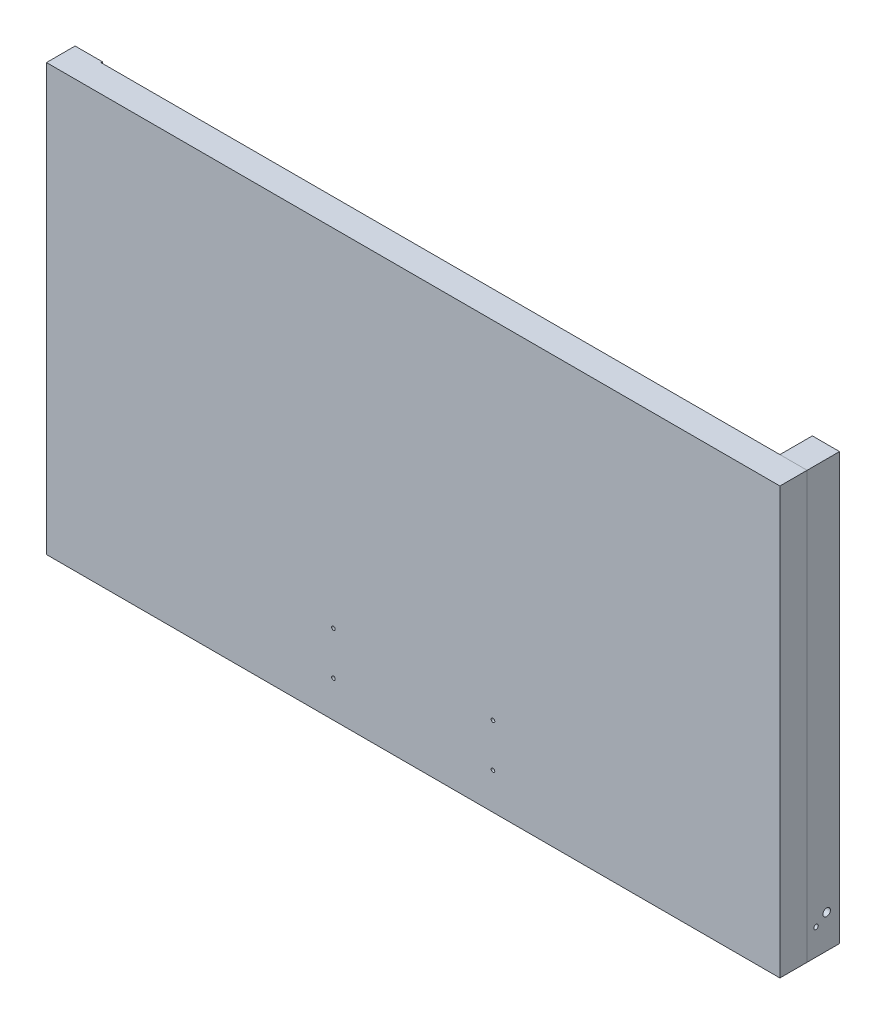
ISO-10303-21;
HEADER;
FILE_DESCRIPTION(('STEP AP214'),'2;1');
FILE_NAME('part.step','',(''),(''),'','','');
FILE_SCHEMA(('AUTOMOTIVE_DESIGN { 1 0 10303 214 1 1 1 1 }'));
ENDSEC;
DATA;
#1=APPLICATION_CONTEXT('core data for automotive mechanical design processes');
#2=APPLICATION_PROTOCOL_DEFINITION('international standard','automotive_design',2000,#1);
#3=PRODUCT_CONTEXT('',#1,'mechanical');
#4=PRODUCT('Part','Part','',(#3));
#5=PRODUCT_RELATED_PRODUCT_CATEGORY('part','',(#4));
#6=PRODUCT_DEFINITION_FORMATION('','',#4);
#7=PRODUCT_DEFINITION_CONTEXT('part definition',#1,'design');
#8=PRODUCT_DEFINITION('design','',#6,#7);
#9=PRODUCT_DEFINITION_SHAPE('','',#8);
#10=(LENGTH_UNIT() NAMED_UNIT(*) SI_UNIT(.MILLI.,.METRE.));
#11=(NAMED_UNIT(*) PLANE_ANGLE_UNIT() SI_UNIT($,.RADIAN.));
#12=(NAMED_UNIT(*) SI_UNIT($,.STERADIAN.) SOLID_ANGLE_UNIT());
#13=UNCERTAINTY_MEASURE_WITH_UNIT(LENGTH_MEASURE(1.E-05),#10,'distance_accuracy_value','');
#14=(GEOMETRIC_REPRESENTATION_CONTEXT(3) GLOBAL_UNCERTAINTY_ASSIGNED_CONTEXT((#13)) GLOBAL_UNIT_ASSIGNED_CONTEXT((#10,
#11,#12)) REPRESENTATION_CONTEXT('',''));
#15=CARTESIAN_POINT('',(0.,0.,0.));
#16=DIRECTION('',(0.,0.,1.));
#17=DIRECTION('',(1.,0.,0.));
#18=AXIS2_PLACEMENT_3D('',#15,#16,#17);
#19=CARTESIAN_POINT('',(490.77,296.1,0.));
#20=DIRECTION('',(0.,0.,1.));
#21=DIRECTION('',(1.,0.,0.));
#22=AXIS2_PLACEMENT_3D('',#19,#20,#21);
#23=PLANE('',#22);
#24=DIRECTION('',(0.,-1.,0.));
#25=VECTOR('',#24,1.);
#26=CARTESIAN_POINT('',(509.67,296.1,0.));
#27=LINE('',#26,#25);
#28=CARTESIAN_POINT('',(509.67,296.1,0.));
#29=VERTEX_POINT('',#28);
#30=CARTESIAN_POINT('',(509.67,0.,0.));
#31=VERTEX_POINT('',#30);
#32=EDGE_CURVE('E114',#29,#31,#27,.T.);
#33=ORIENTED_EDGE('',*,*,#32,.F.);
#34=DIRECTION('',(1.,0.,0.));
#35=VECTOR('',#34,1.);
#36=CARTESIAN_POINT('',(490.77,296.1,0.));
#37=LINE('',#36,#35);
#38=CARTESIAN_POINT('',(490.77,296.1,0.));
#39=VERTEX_POINT('',#38);
#40=EDGE_CURVE('E12',#39,#29,#37,.T.);
#41=ORIENTED_EDGE('',*,*,#40,.F.);
#42=DIRECTION('',(0.,-1.,0.));
#43=VECTOR('',#42,1.);
#44=CARTESIAN_POINT('',(490.77,296.1,0.));
#45=LINE('',#44,#43);
#46=CARTESIAN_POINT('',(490.77,0.,0.));
#47=VERTEX_POINT('',#46);
#48=EDGE_CURVE('E107',#39,#47,#45,.T.);
#49=ORIENTED_EDGE('',*,*,#48,.T.);
#50=DIRECTION('',(1.,0.,0.));
#51=VECTOR('',#50,1.);
#52=CARTESIAN_POINT('',(490.77,0.,0.));
#53=LINE('',#52,#51);
#54=EDGE_CURVE('E52',#47,#31,#53,.T.);
#55=ORIENTED_EDGE('',*,*,#54,.T.);
#56=EDGE_LOOP('',(#33,#41,#49,#55));
#57=FACE_BOUND('',#56,.T.);
#58=ADVANCED_FACE('F49',(#57),#23,.T.);
#59=CARTESIAN_POINT('',(490.77,296.1,0.));
#60=DIRECTION('',(0.,1.,0.));
#61=DIRECTION('',(0.,0.,1.));
#62=AXIS2_PLACEMENT_3D('',#59,#60,#61);
#63=PLANE('',#62);
#64=DIRECTION('',(0.,0.,1.));
#65=VECTOR('',#64,1.);
#66=CARTESIAN_POINT('',(509.67,296.1,0.));
#67=LINE('',#66,#65);
#68=CARTESIAN_POINT('',(509.67,296.1,-22.5375388618416));
#69=VERTEX_POINT('',#68);
#70=EDGE_CURVE('E109',#69,#29,#67,.T.);
#71=ORIENTED_EDGE('',*,*,#70,.F.);
#72=DIRECTION('',(1.,0.,0.));
#73=VECTOR('',#72,1.);
#74=CARTESIAN_POINT('',(490.77,296.1,-22.5375388618416));
#75=LINE('',#74,#73);
#76=CARTESIAN_POINT('',(490.77,296.1,-22.5375388618416));
#77=VERTEX_POINT('',#76);
#78=EDGE_CURVE('E58',#77,#69,#75,.T.);
#79=ORIENTED_EDGE('',*,*,#78,.F.);
#80=DIRECTION('',(0.,0.,1.));
#81=VECTOR('',#80,1.);
#82=CARTESIAN_POINT('',(490.77,296.1,0.));
#83=LINE('',#82,#81);
#84=EDGE_CURVE('E104',#77,#39,#83,.T.);
#85=ORIENTED_EDGE('',*,*,#84,.T.);
#86=ORIENTED_EDGE('',*,*,#40,.T.);
#87=EDGE_LOOP('',(#71,#79,#85,#86));
#88=FACE_BOUND('',#87,.T.);
#89=ADVANCED_FACE('F125',(#88),#63,.T.);
#90=CARTESIAN_POINT('',(490.77,296.1,-22.5375388618416));
#91=DIRECTION('',(0.,0.,-1.));
#92=DIRECTION('',(0.,1.,0.));
#93=AXIS2_PLACEMENT_3D('',#90,#91,#92);
#94=PLANE('',#93);
#95=DIRECTION('',(0.,1.,0.));
#96=VECTOR('',#95,1.);
#97=CARTESIAN_POINT('',(509.67,296.1,-22.5375388618416));
#98=LINE('',#97,#96);
#99=CARTESIAN_POINT('',(509.67,0.,-22.5375388618417));
#100=VERTEX_POINT('',#99);
#101=EDGE_CURVE('E99',#100,#69,#98,.T.);
#102=ORIENTED_EDGE('',*,*,#101,.F.);
#103=DIRECTION('',(1.,0.,0.));
#104=VECTOR('',#103,1.);
#105=CARTESIAN_POINT('',(490.77,0.,-22.5375388618417));
#106=LINE('',#105,#104);
#107=CARTESIAN_POINT('',(490.77,0.,-22.5375388618417));
#108=VERTEX_POINT('',#107);
#109=EDGE_CURVE('E94',#108,#100,#106,.T.);
#110=ORIENTED_EDGE('',*,*,#109,.F.);
#111=DIRECTION('',(0.,1.,0.));
#112=VECTOR('',#111,1.);
#113=CARTESIAN_POINT('',(490.77,296.1,-22.5375388618416));
#114=LINE('',#113,#112);
#115=EDGE_CURVE('E97',#108,#77,#114,.T.);
#116=ORIENTED_EDGE('',*,*,#115,.T.);
#117=ORIENTED_EDGE('',*,*,#78,.T.);
#118=EDGE_LOOP('',(#102,#110,#116,#117));
#119=FACE_BOUND('',#118,.T.);
#120=ADVANCED_FACE('F96',(#119),#94,.T.);
#121=CARTESIAN_POINT('',(490.77,0.,0.));
#122=DIRECTION('',(0.,-1.,0.));
#123=DIRECTION('',(0.,0.,-1.));
#124=AXIS2_PLACEMENT_3D('',#121,#122,#123);
#125=PLANE('',#124);
#126=DIRECTION('',(0.,0.,-1.));
#127=VECTOR('',#126,1.);
#128=CARTESIAN_POINT('',(509.67,0.,0.));
#129=LINE('',#128,#127);
#130=EDGE_CURVE('E117',#31,#100,#129,.T.);
#131=ORIENTED_EDGE('',*,*,#130,.F.);
#132=ORIENTED_EDGE('',*,*,#54,.F.);
#133=DIRECTION('',(0.,0.,-1.));
#134=VECTOR('',#133,1.);
#135=CARTESIAN_POINT('',(490.77,0.,0.));
#136=LINE('',#135,#134);
#137=EDGE_CURVE('E103',#47,#108,#136,.T.);
#138=ORIENTED_EDGE('',*,*,#137,.T.);
#139=ORIENTED_EDGE('',*,*,#109,.T.);
#140=EDGE_LOOP('',(#131,#132,#138,#139));
#141=FACE_BOUND('',#140,.T.);
#142=ADVANCED_FACE('F106',(#141),#125,.T.);
#143=CARTESIAN_POINT('',(490.77,0.,0.));
#144=DIRECTION('',(1.,0.,0.));
#145=DIRECTION('',(0.,0.,-1.));
#146=AXIS2_PLACEMENT_3D('',#143,#144,#145);
#147=PLANE('',#146);
#148=CARTESIAN_POINT('',(490.77,23.3159423896292,-13.5682290739743));
#149=DIRECTION('',(1.,0.,0.));
#150=DIRECTION('',(0.,0.,-1.));
#151=AXIS2_PLACEMENT_3D('',#148,#149,#150);
#152=CIRCLE('',#151,2.6);
#153=CARTESIAN_POINT('',(490.77,23.3159423896292,-16.1682290739743));
#154=VERTEX_POINT('',#153);
#155=EDGE_CURVE('E158',#154,#154,#152,.T.);
#156=ORIENTED_EDGE('',*,*,#155,.T.);
#157=EDGE_LOOP('',(#156));
#158=FACE_BOUND('',#157,.T.);
#159=CARTESIAN_POINT('',(490.77,18.1537544624698,-6.19586067537359));
#160=DIRECTION('',(1.,0.,0.));
#161=DIRECTION('',(0.,0.,-1.));
#162=AXIS2_PLACEMENT_3D('',#159,#160,#161);
#163=CIRCLE('',#162,1.57499999999978);
#164=CARTESIAN_POINT('',(490.77,18.1537544624698,-7.77086067537337));
#165=VERTEX_POINT('',#164);
#166=EDGE_CURVE('E118',#165,#165,#163,.T.);
#167=ORIENTED_EDGE('',*,*,#166,.T.);
#168=EDGE_LOOP('',(#167));
#169=FACE_BOUND('',#168,.T.);
#170=ORIENTED_EDGE('',*,*,#48,.F.);
#171=ORIENTED_EDGE('',*,*,#84,.F.);
#172=ORIENTED_EDGE('',*,*,#115,.F.);
#173=ORIENTED_EDGE('',*,*,#137,.F.);
#174=EDGE_LOOP('',(#170,#171,#172,#173));
#175=FACE_BOUND('',#174,.T.);
#176=ADVANCED_FACE('F102',(#158,#169,#175),#147,.F.);
#177=CARTESIAN_POINT('',(509.67,0.,0.));
#178=DIRECTION('',(1.,0.,0.));
#179=DIRECTION('',(0.,0.,-1.));
#180=AXIS2_PLACEMENT_3D('',#177,#178,#179);
#181=PLANE('',#180);
#182=CARTESIAN_POINT('',(509.67,23.3159423896292,-13.5682290739743));
#183=DIRECTION('',(1.,0.,0.));
#184=DIRECTION('',(0.,0.,-1.));
#185=AXIS2_PLACEMENT_3D('',#182,#183,#184);
#186=CIRCLE('',#185,2.6);
#187=CARTESIAN_POINT('',(509.67,23.3159423896292,-16.1682290739743));
#188=VERTEX_POINT('',#187);
#189=EDGE_CURVE('E161',#188,#188,#186,.T.);
#190=ORIENTED_EDGE('',*,*,#189,.F.);
#191=EDGE_LOOP('',(#190));
#192=FACE_BOUND('',#191,.T.);
#193=CARTESIAN_POINT('',(509.67,18.1537544624698,-6.19586067537359));
#194=DIRECTION('',(1.,0.,0.));
#195=DIRECTION('',(0.,0.,-1.));
#196=AXIS2_PLACEMENT_3D('',#193,#194,#195);
#197=CIRCLE('',#196,1.57499999999978);
#198=CARTESIAN_POINT('',(509.67,18.1537544624698,-7.77086067537337));
#199=VERTEX_POINT('',#198);
#200=EDGE_CURVE('E163',#199,#199,#197,.T.);
#201=ORIENTED_EDGE('',*,*,#200,.F.);
#202=EDGE_LOOP('',(#201));
#203=FACE_BOUND('',#202,.T.);
#204=ORIENTED_EDGE('',*,*,#32,.T.);
#205=ORIENTED_EDGE('',*,*,#130,.T.);
#206=ORIENTED_EDGE('',*,*,#101,.T.);
#207=ORIENTED_EDGE('',*,*,#70,.T.);
#208=EDGE_LOOP('',(#204,#205,#206,#207));
#209=FACE_BOUND('',#208,.T.);
#210=ADVANCED_FACE('F124',(#192,#203,#209),#181,.T.);
#211=CARTESIAN_POINT('',(490.77,18.1537544624698,-6.19586067537359));
#212=DIRECTION('',(1.,0.,0.));
#213=DIRECTION('',(0.,0.,-1.));
#214=AXIS2_PLACEMENT_3D('',#211,#212,#213);
#215=CYLINDRICAL_SURFACE('',#214,1.57499999999978);
#216=ORIENTED_EDGE('',*,*,#166,.F.);
#217=EDGE_LOOP('',(#216));
#218=FACE_BOUND('',#217,.T.);
#219=ORIENTED_EDGE('',*,*,#200,.T.);
#220=EDGE_LOOP('',(#219));
#221=FACE_BOUND('',#220,.T.);
#222=ADVANCED_FACE('F143',(#218,#221),#215,.F.);
#223=CARTESIAN_POINT('',(490.77,23.3159423896292,-13.5682290739743));
#224=DIRECTION('',(1.,0.,0.));
#225=DIRECTION('',(0.,0.,-1.));
#226=AXIS2_PLACEMENT_3D('',#223,#224,#225);
#227=CYLINDRICAL_SURFACE('',#226,2.6);
#228=ORIENTED_EDGE('',*,*,#155,.F.);
#229=EDGE_LOOP('',(#228));
#230=FACE_BOUND('',#229,.T.);
#231=ORIENTED_EDGE('',*,*,#189,.T.);
#232=EDGE_LOOP('',(#231));
#233=FACE_BOUND('',#232,.T.);
#234=ADVANCED_FACE('F150',(#230,#233),#227,.F.);
#235=CLOSED_SHELL('',(#58,#89,#120,#142,#176,#210,#222,#234));
#236=MANIFOLD_SOLID_BREP('B2',#235);
#237=CARTESIAN_POINT('',(0.,0.,18.9));
#238=DIRECTION('',(0.,0.,-1.));
#239=DIRECTION('',(-1.,0.,0.));
#240=AXIS2_PLACEMENT_3D('',#237,#238,#239);
#241=PLANE('',#240);
#242=CARTESIAN_POINT('',(310.28,55.3497179719063,18.9));
#243=DIRECTION('',(0.,0.,1.));
#244=DIRECTION('',(1.,0.,0.));
#245=AXIS2_PLACEMENT_3D('',#242,#243,#244);
#246=CIRCLE('',#245,1.26499999999998);
#247=CARTESIAN_POINT('',(311.545,55.3497179719063,18.9));
#248=VERTEX_POINT('',#247);
#249=EDGE_CURVE('E339',#248,#248,#246,.T.);
#250=ORIENTED_EDGE('',*,*,#249,.F.);
#251=EDGE_LOOP('',(#250));
#252=FACE_BOUND('',#251,.T.);
#253=CARTESIAN_POINT('',(310.28,25.3497179719062,18.9));
#254=DIRECTION('',(0.,0.,1.));
#255=DIRECTION('',(1.,0.,0.));
#256=AXIS2_PLACEMENT_3D('',#253,#254,#255);
#257=CIRCLE('',#256,1.26499999999998);
#258=CARTESIAN_POINT('',(311.545,25.3497179719062,18.9));
#259=VERTEX_POINT('',#258);
#260=EDGE_CURVE('E325',#259,#259,#257,.T.);
#261=ORIENTED_EDGE('',*,*,#260,.F.);
#262=EDGE_LOOP('',(#261));
#263=FACE_BOUND('',#262,.T.);
#264=DIRECTION('',(0.,-1.,0.));
#265=VECTOR('',#264,1.);
#266=CARTESIAN_POINT('',(0.,0.,18.9));
#267=LINE('',#266,#265);
#268=CARTESIAN_POINT('',(0.,296.1,18.9));
#269=VERTEX_POINT('',#268);
#270=CARTESIAN_POINT('',(0.,0.,18.9));
#271=VERTEX_POINT('',#270);
#272=EDGE_CURVE('E307',#269,#271,#267,.T.);
#273=ORIENTED_EDGE('',*,*,#272,.T.);
#274=DIRECTION('',(1.,0.,0.));
#275=VECTOR('',#274,1.);
#276=CARTESIAN_POINT('',(0.,0.,18.9));
#277=LINE('',#276,#275);
#278=CARTESIAN_POINT('',(509.67,0.,18.9));
#279=VERTEX_POINT('',#278);
#280=EDGE_CURVE('E264',#271,#279,#277,.T.);
#281=ORIENTED_EDGE('',*,*,#280,.T.);
#282=DIRECTION('',(0.,1.,0.));
#283=VECTOR('',#282,1.);
#284=CARTESIAN_POINT('',(509.67,0.,18.9));
#285=LINE('',#284,#283);
#286=CARTESIAN_POINT('',(509.67,296.1,18.9));
#287=VERTEX_POINT('',#286);
#288=EDGE_CURVE('E311',#279,#287,#285,.T.);
#289=ORIENTED_EDGE('',*,*,#288,.T.);
#290=DIRECTION('',(-1.,0.,0.));
#291=VECTOR('',#290,1.);
#292=CARTESIAN_POINT('',(0.,296.1,18.9));
#293=LINE('',#292,#291);
#294=EDGE_CURVE('E241',#287,#269,#293,.T.);
#295=ORIENTED_EDGE('',*,*,#294,.T.);
#296=EDGE_LOOP('',(#273,#281,#289,#295));
#297=FACE_BOUND('',#296,.T.);
#298=CARTESIAN_POINT('',(199.39,55.3497179719063,18.9));
#299=DIRECTION('',(0.,0.,-1.));
#300=DIRECTION('',(-1.,0.,0.));
#301=AXIS2_PLACEMENT_3D('',#298,#299,#300);
#302=CIRCLE('',#301,1.26500000000001);
#303=CARTESIAN_POINT('',(198.125,55.3497179719063,18.9));
#304=VERTEX_POINT('',#303);
#305=EDGE_CURVE('E343',#304,#304,#302,.T.);
#306=ORIENTED_EDGE('',*,*,#305,.T.);
#307=EDGE_LOOP('',(#306));
#308=FACE_BOUND('',#307,.T.);
#309=CARTESIAN_POINT('',(199.39,25.3497179719062,18.9));
#310=DIRECTION('',(0.,0.,-1.));
#311=DIRECTION('',(-1.,0.,0.));
#312=AXIS2_PLACEMENT_3D('',#309,#310,#311);
#313=CIRCLE('',#312,1.26500000000001);
#314=CARTESIAN_POINT('',(198.125,25.3497179719062,18.9));
#315=VERTEX_POINT('',#314);
#316=EDGE_CURVE('E340',#315,#315,#313,.T.);
#317=ORIENTED_EDGE('',*,*,#316,.T.);
#318=EDGE_LOOP('',(#317));
#319=FACE_BOUND('',#318,.T.);
#320=ADVANCED_FACE('F215',(#252,#263,#297,#308,#319),#241,.F.);
#321=CARTESIAN_POINT('',(0.,0.,0.));
#322=DIRECTION('',(0.,0.,-1.));
#323=DIRECTION('',(-1.,0.,0.));
#324=AXIS2_PLACEMENT_3D('',#321,#322,#323);
#325=PLANE('',#324);
#326=CARTESIAN_POINT('',(199.39,55.3497179719063,0.));
#327=DIRECTION('',(0.,0.,-1.));
#328=DIRECTION('',(-1.,0.,0.));
#329=AXIS2_PLACEMENT_3D('',#326,#327,#328);
#330=CIRCLE('',#329,1.26500000000001);
#331=CARTESIAN_POINT('',(198.125,55.3497179719063,0.));
#332=VERTEX_POINT('',#331);
#333=EDGE_CURVE('E327',#332,#332,#330,.F.);
#334=ORIENTED_EDGE('',*,*,#333,.T.);
#335=EDGE_LOOP('',(#334));
#336=FACE_BOUND('',#335,.T.);
#337=CARTESIAN_POINT('',(310.28,55.3497179719063,0.));
#338=DIRECTION('',(0.,0.,-1.));
#339=DIRECTION('',(-1.,0.,0.));
#340=AXIS2_PLACEMENT_3D('',#337,#338,#339);
#341=CIRCLE('',#340,1.26499999999998);
#342=CARTESIAN_POINT('',(309.015,55.3497179719063,0.));
#343=VERTEX_POINT('',#342);
#344=EDGE_CURVE('E324',#343,#343,#341,.T.);
#345=ORIENTED_EDGE('',*,*,#344,.F.);
#346=EDGE_LOOP('',(#345));
#347=FACE_BOUND('',#346,.T.);
#348=CARTESIAN_POINT('',(310.28,25.3497179719062,0.));
#349=DIRECTION('',(0.,0.,-1.));
#350=DIRECTION('',(-1.,0.,0.));
#351=AXIS2_PLACEMENT_3D('',#348,#349,#350);
#352=CIRCLE('',#351,1.26499999999998);
#353=CARTESIAN_POINT('',(309.015,25.3497179719062,0.));
#354=VERTEX_POINT('',#353);
#355=EDGE_CURVE('E321',#354,#354,#352,.T.);
#356=ORIENTED_EDGE('',*,*,#355,.F.);
#357=EDGE_LOOP('',(#356));
#358=FACE_BOUND('',#357,.T.);
#359=DIRECTION('',(0.,-1.,0.));
#360=VECTOR('',#359,1.);
#361=CARTESIAN_POINT('',(18.9,296.1,0.));
#362=LINE('',#361,#360);
#363=CARTESIAN_POINT('',(18.9,296.1,0.));
#364=VERTEX_POINT('',#363);
#365=CARTESIAN_POINT('',(18.9,0.,0.));
#366=VERTEX_POINT('',#365);
#367=EDGE_CURVE('E232',#364,#366,#362,.T.);
#368=ORIENTED_EDGE('',*,*,#367,.F.);
#369=DIRECTION('',(-1.,0.,0.));
#370=VECTOR('',#369,1.);
#371=CARTESIAN_POINT('',(0.,296.1,0.));
#372=LINE('',#371,#370);
#373=CARTESIAN_POINT('',(509.67,296.1,0.));
#374=VERTEX_POINT('',#373);
#375=EDGE_CURVE('E309',#374,#364,#372,.T.);
#376=ORIENTED_EDGE('',*,*,#375,.F.);
#377=DIRECTION('',(0.,1.,0.));
#378=VECTOR('',#377,1.);
#379=CARTESIAN_POINT('',(509.67,0.,0.));
#380=LINE('',#379,#378);
#381=CARTESIAN_POINT('',(509.67,0.,0.));
#382=VERTEX_POINT('',#381);
#383=EDGE_CURVE('E257',#382,#374,#380,.T.);
#384=ORIENTED_EDGE('',*,*,#383,.F.);
#385=DIRECTION('',(1.,0.,0.));
#386=VECTOR('',#385,1.);
#387=CARTESIAN_POINT('',(0.,0.,0.));
#388=LINE('',#387,#386);
#389=EDGE_CURVE('E300',#366,#382,#388,.T.);
#390=ORIENTED_EDGE('',*,*,#389,.F.);
#391=EDGE_LOOP('',(#368,#376,#384,#390));
#392=FACE_BOUND('',#391,.T.);
#393=CARTESIAN_POINT('',(199.39,25.3497179719062,0.));
#394=DIRECTION('',(0.,0.,-1.));
#395=DIRECTION('',(-1.,0.,0.));
#396=AXIS2_PLACEMENT_3D('',#393,#394,#395);
#397=CIRCLE('',#396,1.26500000000001);
#398=CARTESIAN_POINT('',(198.125,25.3497179719062,0.));
#399=VERTEX_POINT('',#398);
#400=EDGE_CURVE('E219',#399,#399,#397,.F.);
#401=ORIENTED_EDGE('',*,*,#400,.T.);
#402=EDGE_LOOP('',(#401));
#403=FACE_BOUND('',#402,.T.);
#404=ADVANCED_FACE('F353',(#336,#347,#358,#392,#403),#325,.T.);
#405=CARTESIAN_POINT('',(0.,0.,18.9));
#406=DIRECTION('',(1.,0.,0.));
#407=DIRECTION('',(0.,0.,-1.));
#408=AXIS2_PLACEMENT_3D('',#405,#406,#407);
#409=PLANE('',#408);
#410=DIRECTION('',(0.,0.,-1.));
#411=VECTOR('',#410,1.);
#412=CARTESIAN_POINT('',(0.,296.1,18.9));
#413=LINE('',#412,#411);
#414=CARTESIAN_POINT('',(0.,296.1,-0.999999999999965));
#415=VERTEX_POINT('',#414);
#416=EDGE_CURVE('E313',#269,#415,#413,.T.);
#417=ORIENTED_EDGE('',*,*,#416,.T.);
#418=DIRECTION('',(0.,1.,0.));
#419=VECTOR('',#418,1.);
#420=CARTESIAN_POINT('',(0.,296.1,-0.999999999999965));
#421=LINE('',#420,#419);
#422=CARTESIAN_POINT('',(0.,0.,-0.999999999999965));
#423=VERTEX_POINT('',#422);
#424=EDGE_CURVE('E288',#423,#415,#421,.T.);
#425=ORIENTED_EDGE('',*,*,#424,.F.);
#426=DIRECTION('',(0.,0.,-1.));
#427=VECTOR('',#426,1.);
#428=CARTESIAN_POINT('',(0.,0.,18.9));
#429=LINE('',#428,#427);
#430=EDGE_CURVE('E47',#271,#423,#429,.T.);
#431=ORIENTED_EDGE('',*,*,#430,.F.);
#432=ORIENTED_EDGE('',*,*,#272,.F.);
#433=EDGE_LOOP('',(#417,#425,#431,#432));
#434=FACE_BOUND('',#433,.T.);
#435=ADVANCED_FACE('F217',(#434),#409,.F.);
#436=CARTESIAN_POINT('',(0.,0.,18.9));
#437=DIRECTION('',(0.,1.,0.));
#438=DIRECTION('',(0.,0.,1.));
#439=AXIS2_PLACEMENT_3D('',#436,#437,#438);
#440=PLANE('',#439);
#441=ORIENTED_EDGE('',*,*,#430,.T.);
#442=DIRECTION('',(-1.,0.,0.));
#443=VECTOR('',#442,1.);
#444=CARTESIAN_POINT('',(18.9,0.,-0.999999999999965));
#445=LINE('',#444,#443);
#446=CARTESIAN_POINT('',(18.9,0.,-0.999999999999965));
#447=VERTEX_POINT('',#446);
#448=EDGE_CURVE('E279',#447,#423,#445,.T.);
#449=ORIENTED_EDGE('',*,*,#448,.F.);
#450=DIRECTION('',(0.,0.,1.));
#451=VECTOR('',#450,1.);
#452=CARTESIAN_POINT('',(18.9,0.,-0.999999999999965));
#453=LINE('',#452,#451);
#454=EDGE_CURVE('E283',#447,#366,#453,.T.);
#455=ORIENTED_EDGE('',*,*,#454,.T.);
#456=ORIENTED_EDGE('',*,*,#389,.T.);
#457=DIRECTION('',(0.,0.,-1.));
#458=VECTOR('',#457,1.);
#459=CARTESIAN_POINT('',(509.67,0.,18.9));
#460=LINE('',#459,#458);
#461=EDGE_CURVE('E224',#279,#382,#460,.T.);
#462=ORIENTED_EDGE('',*,*,#461,.F.);
#463=ORIENTED_EDGE('',*,*,#280,.F.);
#464=EDGE_LOOP('',(#441,#449,#455,#456,#462,#463));
#465=FACE_BOUND('',#464,.T.);
#466=ADVANCED_FACE('F281',(#465),#440,.F.);
#467=CARTESIAN_POINT('',(509.67,0.,18.9));
#468=DIRECTION('',(-1.,0.,0.));
#469=DIRECTION('',(0.,0.,1.));
#470=AXIS2_PLACEMENT_3D('',#467,#468,#469);
#471=PLANE('',#470);
#472=ORIENTED_EDGE('',*,*,#383,.T.);
#473=DIRECTION('',(0.,0.,-1.));
#474=VECTOR('',#473,1.);
#475=CARTESIAN_POINT('',(509.67,296.1,18.9));
#476=LINE('',#475,#474);
#477=EDGE_CURVE('E318',#287,#374,#476,.T.);
#478=ORIENTED_EDGE('',*,*,#477,.F.);
#479=ORIENTED_EDGE('',*,*,#288,.F.);
#480=ORIENTED_EDGE('',*,*,#461,.T.);
#481=EDGE_LOOP('',(#472,#478,#479,#480));
#482=FACE_BOUND('',#481,.T.);
#483=ADVANCED_FACE('F387',(#482),#471,.F.);
#484=CARTESIAN_POINT('',(0.,296.1,18.9));
#485=DIRECTION('',(0.,-1.,0.));
#486=DIRECTION('',(0.,0.,-1.));
#487=AXIS2_PLACEMENT_3D('',#484,#485,#486);
#488=PLANE('',#487);
#489=ORIENTED_EDGE('',*,*,#375,.T.);
#490=DIRECTION('',(0.,0.,1.));
#491=VECTOR('',#490,1.);
#492=CARTESIAN_POINT('',(18.9,296.1,-0.999999999999965));
#493=LINE('',#492,#491);
#494=CARTESIAN_POINT('',(18.9,296.1,-0.999999999999965));
#495=VERTEX_POINT('',#494);
#496=EDGE_CURVE('E301',#495,#364,#493,.T.);
#497=ORIENTED_EDGE('',*,*,#496,.F.);
#498=DIRECTION('',(1.,0.,0.));
#499=VECTOR('',#498,1.);
#500=CARTESIAN_POINT('',(18.9,296.1,-0.999999999999965));
#501=LINE('',#500,#499);
#502=EDGE_CURVE('E294',#415,#495,#501,.T.);
#503=ORIENTED_EDGE('',*,*,#502,.F.);
#504=ORIENTED_EDGE('',*,*,#416,.F.);
#505=ORIENTED_EDGE('',*,*,#294,.F.);
#506=ORIENTED_EDGE('',*,*,#477,.T.);
#507=EDGE_LOOP('',(#489,#497,#503,#504,#505,#506));
#508=FACE_BOUND('',#507,.T.);
#509=ADVANCED_FACE('F381',(#508),#488,.F.);
#510=CARTESIAN_POINT('',(18.9,296.1,-0.999999999999965));
#511=DIRECTION('',(-1.,0.,0.));
#512=DIRECTION('',(0.,-1.,0.));
#513=AXIS2_PLACEMENT_3D('',#510,#511,#512);
#514=PLANE('',#513);
#515=ORIENTED_EDGE('',*,*,#367,.T.);
#516=ORIENTED_EDGE('',*,*,#454,.F.);
#517=DIRECTION('',(0.,-1.,0.));
#518=VECTOR('',#517,1.);
#519=CARTESIAN_POINT('',(18.9,296.1,-0.999999999999965));
#520=LINE('',#519,#518);
#521=EDGE_CURVE('E289',#495,#447,#520,.T.);
#522=ORIENTED_EDGE('',*,*,#521,.F.);
#523=ORIENTED_EDGE('',*,*,#496,.T.);
#524=EDGE_LOOP('',(#515,#516,#522,#523));
#525=FACE_BOUND('',#524,.T.);
#526=ADVANCED_FACE('F299',(#525),#514,.F.);
#527=CARTESIAN_POINT('',(0.,0.,-0.999999999999965));
#528=DIRECTION('',(0.,0.,-1.));
#529=DIRECTION('',(-1.,0.,0.));
#530=AXIS2_PLACEMENT_3D('',#527,#528,#529);
#531=PLANE('',#530);
#532=ORIENTED_EDGE('',*,*,#521,.T.);
#533=ORIENTED_EDGE('',*,*,#448,.T.);
#534=ORIENTED_EDGE('',*,*,#424,.T.);
#535=ORIENTED_EDGE('',*,*,#502,.T.);
#536=EDGE_LOOP('',(#532,#533,#534,#535));
#537=FACE_BOUND('',#536,.T.);
#538=ADVANCED_FACE('F292',(#537),#531,.T.);
#539=CARTESIAN_POINT('',(310.28,25.3497179719062,-22.5375388618417));
#540=DIRECTION('',(0.,0.,1.));
#541=DIRECTION('',(1.,0.,0.));
#542=AXIS2_PLACEMENT_3D('',#539,#540,#541);
#543=CYLINDRICAL_SURFACE('',#542,1.26499999999998);
#544=ORIENTED_EDGE('',*,*,#355,.T.);
#545=EDGE_LOOP('',(#544));
#546=FACE_BOUND('',#545,.T.);
#547=ORIENTED_EDGE('',*,*,#260,.T.);
#548=EDGE_LOOP('',(#547));
#549=FACE_BOUND('',#548,.T.);
#550=ADVANCED_FACE('F374',(#546,#549),#543,.F.);
#551=CARTESIAN_POINT('',(310.28,55.3497179719063,-22.5375388618417));
#552=DIRECTION('',(0.,0.,1.));
#553=DIRECTION('',(1.,0.,0.));
#554=AXIS2_PLACEMENT_3D('',#551,#552,#553);
#555=CYLINDRICAL_SURFACE('',#554,1.26499999999998);
#556=ORIENTED_EDGE('',*,*,#344,.T.);
#557=EDGE_LOOP('',(#556));
#558=FACE_BOUND('',#557,.T.);
#559=ORIENTED_EDGE('',*,*,#249,.T.);
#560=EDGE_LOOP('',(#559));
#561=FACE_BOUND('',#560,.T.);
#562=ADVANCED_FACE('F349',(#558,#561),#555,.F.);
#563=CARTESIAN_POINT('',(199.39,55.3497179719063,-22.5375388618417));
#564=DIRECTION('',(0.,0.,1.));
#565=DIRECTION('',(1.,0.,0.));
#566=AXIS2_PLACEMENT_3D('',#563,#564,#565);
#567=CYLINDRICAL_SURFACE('',#566,1.26500000000001);
#568=ORIENTED_EDGE('',*,*,#333,.F.);
#569=EDGE_LOOP('',(#568));
#570=FACE_BOUND('',#569,.T.);
#571=ORIENTED_EDGE('',*,*,#305,.F.);
#572=EDGE_LOOP('',(#571));
#573=FACE_BOUND('',#572,.T.);
#574=ADVANCED_FACE('F364',(#570,#573),#567,.F.);
#575=CARTESIAN_POINT('',(199.39,25.3497179719062,-22.5375388618417));
#576=DIRECTION('',(0.,0.,1.));
#577=DIRECTION('',(1.,0.,0.));
#578=AXIS2_PLACEMENT_3D('',#575,#576,#577);
#579=CYLINDRICAL_SURFACE('',#578,1.26500000000001);
#580=ORIENTED_EDGE('',*,*,#400,.F.);
#581=EDGE_LOOP('',(#580));
#582=FACE_BOUND('',#581,.T.);
#583=ORIENTED_EDGE('',*,*,#316,.F.);
#584=EDGE_LOOP('',(#583));
#585=FACE_BOUND('',#584,.T.);
#586=ADVANCED_FACE('F362',(#582,#585),#579,.F.);
#587=CLOSED_SHELL('',(#320,#404,#435,#466,#483,#509,#526,#538,#550,#562,#574,#586));
#588=MANIFOLD_SOLID_BREP('B6',#587);
#589=ADVANCED_BREP_SHAPE_REPRESENTATION('',(#18,#236,#588),#14);
#590=SHAPE_DEFINITION_REPRESENTATION(#9,#589);
ENDSEC;
END-ISO-10303-21;
